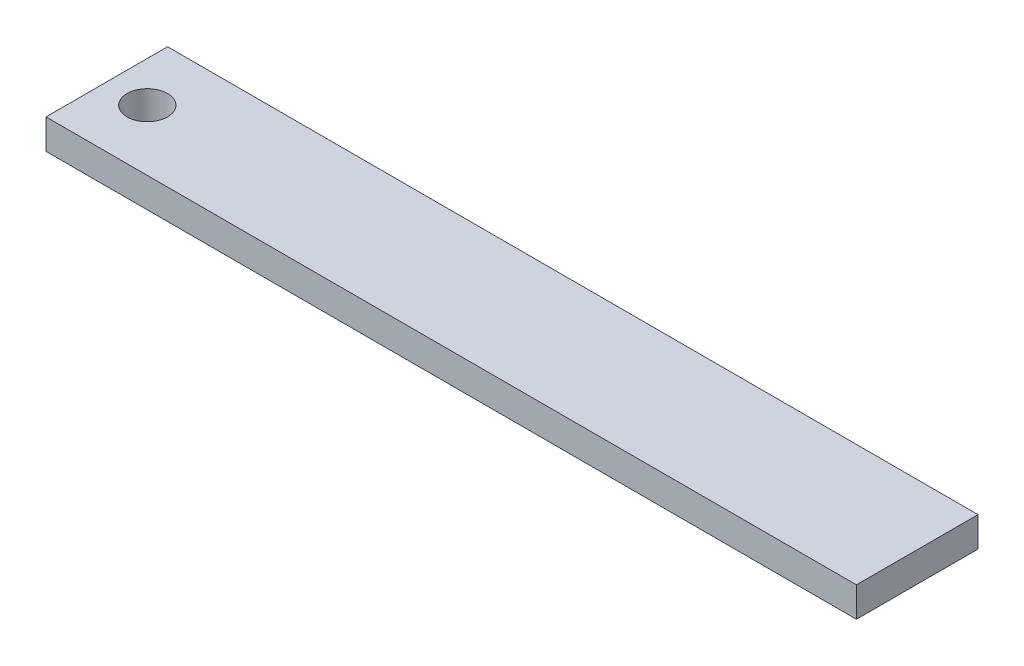
ISO-10303-21;
HEADER;
FILE_DESCRIPTION(('STEP AP214'),'2;1');
FILE_NAME('part.step','',(''),(''),'','','');
FILE_SCHEMA(('AUTOMOTIVE_DESIGN { 1 0 10303 214 1 1 1 1 }'));
ENDSEC;
DATA;
#1=APPLICATION_CONTEXT('core data for automotive mechanical design processes');
#2=APPLICATION_PROTOCOL_DEFINITION('international standard','automotive_design',2000,#1);
#3=PRODUCT_CONTEXT('',#1,'mechanical');
#4=PRODUCT('Part','Part','',(#3));
#5=PRODUCT_RELATED_PRODUCT_CATEGORY('part','',(#4));
#6=PRODUCT_DEFINITION_FORMATION('','',#4);
#7=PRODUCT_DEFINITION_CONTEXT('part definition',#1,'design');
#8=PRODUCT_DEFINITION('design','',#6,#7);
#9=PRODUCT_DEFINITION_SHAPE('','',#8);
#10=(LENGTH_UNIT() NAMED_UNIT(*) SI_UNIT(.MILLI.,.METRE.));
#11=(NAMED_UNIT(*) PLANE_ANGLE_UNIT() SI_UNIT($,.RADIAN.));
#12=(NAMED_UNIT(*) SI_UNIT($,.STERADIAN.) SOLID_ANGLE_UNIT());
#13=UNCERTAINTY_MEASURE_WITH_UNIT(LENGTH_MEASURE(1.E-05),#10,'distance_accuracy_value','');
#14=(GEOMETRIC_REPRESENTATION_CONTEXT(3) GLOBAL_UNCERTAINTY_ASSIGNED_CONTEXT((#13)) GLOBAL_UNIT_ASSIGNED_CONTEXT((#10,
#11,#12)) REPRESENTATION_CONTEXT('',''));
#15=CARTESIAN_POINT('',(0.,0.,0.));
#16=DIRECTION('',(0.,0.,1.));
#17=DIRECTION('',(1.,0.,0.));
#18=AXIS2_PLACEMENT_3D('',#15,#16,#17);
#19=CARTESIAN_POINT('',(10.,-0.7366,-1.5));
#20=DIRECTION('',(1.,0.,0.));
#21=DIRECTION('',(0.,0.,-1.));
#22=AXIS2_PLACEMENT_3D('',#19,#20,#21);
#23=PLANE('',#22);
#24=DIRECTION('',(0.,0.,-1.));
#25=VECTOR('',#24,1.);
#26=CARTESIAN_POINT('',(10.,0.,-1.5));
#27=LINE('',#26,#25);
#28=CARTESIAN_POINT('',(10.,0.,1.5));
#29=VERTEX_POINT('',#28);
#30=CARTESIAN_POINT('',(10.,0.,-1.5));
#31=VERTEX_POINT('',#30);
#32=EDGE_CURVE('E100',#29,#31,#27,.T.);
#33=ORIENTED_EDGE('',*,*,#32,.F.);
#34=DIRECTION('',(0.,1.,0.));
#35=VECTOR('',#34,1.);
#36=CARTESIAN_POINT('',(10.,-0.7366,1.5));
#37=LINE('',#36,#35);
#38=CARTESIAN_POINT('',(10.,-0.7366,1.5));
#39=VERTEX_POINT('',#38);
#40=EDGE_CURVE('E11',#39,#29,#37,.T.);
#41=ORIENTED_EDGE('',*,*,#40,.F.);
#42=DIRECTION('',(0.,0.,-1.));
#43=VECTOR('',#42,1.);
#44=CARTESIAN_POINT('',(10.,-0.7366,-1.5));
#45=LINE('',#44,#43);
#46=CARTESIAN_POINT('',(10.,-0.7366,-1.5));
#47=VERTEX_POINT('',#46);
#48=EDGE_CURVE('E93',#39,#47,#45,.T.);
#49=ORIENTED_EDGE('',*,*,#48,.T.);
#50=DIRECTION('',(0.,1.,0.));
#51=VECTOR('',#50,1.);
#52=CARTESIAN_POINT('',(10.,-0.7366,-1.5));
#53=LINE('',#52,#51);
#54=EDGE_CURVE('E38',#47,#31,#53,.T.);
#55=ORIENTED_EDGE('',*,*,#54,.T.);
#56=EDGE_LOOP('',(#33,#41,#49,#55));
#57=FACE_BOUND('',#56,.T.);
#58=ADVANCED_FACE('F35',(#57),#23,.T.);
#59=CARTESIAN_POINT('',(-10.,-0.7366,1.5));
#60=DIRECTION('',(0.,0.,1.));
#61=DIRECTION('',(1.,0.,0.));
#62=AXIS2_PLACEMENT_3D('',#59,#60,#61);
#63=PLANE('',#62);
#64=DIRECTION('',(1.,0.,0.));
#65=VECTOR('',#64,1.);
#66=CARTESIAN_POINT('',(-10.,0.,1.5));
#67=LINE('',#66,#65);
#68=CARTESIAN_POINT('',(-10.,0.,1.5));
#69=VERTEX_POINT('',#68);
#70=EDGE_CURVE('E95',#69,#29,#67,.T.);
#71=ORIENTED_EDGE('',*,*,#70,.F.);
#72=DIRECTION('',(0.,1.,0.));
#73=VECTOR('',#72,1.);
#74=CARTESIAN_POINT('',(-10.,-0.7366,1.5));
#75=LINE('',#74,#73);
#76=CARTESIAN_POINT('',(-10.,-0.7366,1.5));
#77=VERTEX_POINT('',#76);
#78=EDGE_CURVE('E44',#77,#69,#75,.T.);
#79=ORIENTED_EDGE('',*,*,#78,.F.);
#80=DIRECTION('',(1.,0.,0.));
#81=VECTOR('',#80,1.);
#82=CARTESIAN_POINT('',(-10.,-0.7366,1.5));
#83=LINE('',#82,#81);
#84=EDGE_CURVE('E90',#77,#39,#83,.T.);
#85=ORIENTED_EDGE('',*,*,#84,.T.);
#86=ORIENTED_EDGE('',*,*,#40,.T.);
#87=EDGE_LOOP('',(#71,#79,#85,#86));
#88=FACE_BOUND('',#87,.T.);
#89=ADVANCED_FACE('F111',(#88),#63,.T.);
#90=CARTESIAN_POINT('',(-10.,-0.7366,-1.5));
#91=DIRECTION('',(-1.,0.,0.));
#92=DIRECTION('',(0.,0.,1.));
#93=AXIS2_PLACEMENT_3D('',#90,#91,#92);
#94=PLANE('',#93);
#95=DIRECTION('',(0.,0.,1.));
#96=VECTOR('',#95,1.);
#97=CARTESIAN_POINT('',(-10.,0.,-1.5));
#98=LINE('',#97,#96);
#99=CARTESIAN_POINT('',(-10.,0.,-1.5));
#100=VERTEX_POINT('',#99);
#101=EDGE_CURVE('E85',#100,#69,#98,.T.);
#102=ORIENTED_EDGE('',*,*,#101,.F.);
#103=DIRECTION('',(0.,1.,0.));
#104=VECTOR('',#103,1.);
#105=CARTESIAN_POINT('',(-10.,-0.7366,-1.5));
#106=LINE('',#105,#104);
#107=CARTESIAN_POINT('',(-10.,-0.7366,-1.5));
#108=VERTEX_POINT('',#107);
#109=EDGE_CURVE('E80',#108,#100,#106,.T.);
#110=ORIENTED_EDGE('',*,*,#109,.F.);
#111=DIRECTION('',(0.,0.,1.));
#112=VECTOR('',#111,1.);
#113=CARTESIAN_POINT('',(-10.,-0.7366,-1.5));
#114=LINE('',#113,#112);
#115=EDGE_CURVE('E83',#108,#77,#114,.T.);
#116=ORIENTED_EDGE('',*,*,#115,.T.);
#117=ORIENTED_EDGE('',*,*,#78,.T.);
#118=EDGE_LOOP('',(#102,#110,#116,#117));
#119=FACE_BOUND('',#118,.T.);
#120=ADVANCED_FACE('F82',(#119),#94,.T.);
#121=CARTESIAN_POINT('',(-10.,-0.7366,-1.5));
#122=DIRECTION('',(0.,0.,-1.));
#123=DIRECTION('',(-1.,0.,0.));
#124=AXIS2_PLACEMENT_3D('',#121,#122,#123);
#125=PLANE('',#124);
#126=DIRECTION('',(-1.,0.,0.));
#127=VECTOR('',#126,1.);
#128=CARTESIAN_POINT('',(-10.,0.,-1.5));
#129=LINE('',#128,#127);
#130=EDGE_CURVE('E103',#31,#100,#129,.T.);
#131=ORIENTED_EDGE('',*,*,#130,.F.);
#132=ORIENTED_EDGE('',*,*,#54,.F.);
#133=DIRECTION('',(-1.,0.,0.));
#134=VECTOR('',#133,1.);
#135=CARTESIAN_POINT('',(-10.,-0.7366,-1.5));
#136=LINE('',#135,#134);
#137=EDGE_CURVE('E89',#47,#108,#136,.T.);
#138=ORIENTED_EDGE('',*,*,#137,.T.);
#139=ORIENTED_EDGE('',*,*,#109,.T.);
#140=EDGE_LOOP('',(#131,#132,#138,#139));
#141=FACE_BOUND('',#140,.T.);
#142=ADVANCED_FACE('F92',(#141),#125,.T.);
#143=CARTESIAN_POINT('',(0.,-0.7366,0.));
#144=DIRECTION('',(0.,1.,0.));
#145=DIRECTION('',(0.,0.,1.));
#146=AXIS2_PLACEMENT_3D('',#143,#144,#145);
#147=PLANE('',#146);
#148=CARTESIAN_POINT('',(-9.00000000000001,-0.7366,0.));
#149=DIRECTION('',(0.,1.,0.));
#150=DIRECTION('',(0.,0.,1.));
#151=AXIS2_PLACEMENT_3D('',#148,#149,#150);
#152=CIRCLE('',#151,0.500000000000001);
#153=CARTESIAN_POINT('',(-9.00000000000001,-0.7366,0.500000000000001));
#154=VERTEX_POINT('',#153);
#155=EDGE_CURVE('E104',#154,#154,#152,.T.);
#156=ORIENTED_EDGE('',*,*,#155,.T.);
#157=EDGE_LOOP('',(#156));
#158=FACE_BOUND('',#157,.T.);
#159=ORIENTED_EDGE('',*,*,#48,.F.);
#160=ORIENTED_EDGE('',*,*,#84,.F.);
#161=ORIENTED_EDGE('',*,*,#115,.F.);
#162=ORIENTED_EDGE('',*,*,#137,.F.);
#163=EDGE_LOOP('',(#159,#160,#161,#162));
#164=FACE_BOUND('',#163,.T.);
#165=ADVANCED_FACE('F88',(#158,#164),#147,.F.);
#166=CARTESIAN_POINT('',(0.,0.,0.));
#167=DIRECTION('',(0.,1.,0.));
#168=DIRECTION('',(0.,0.,1.));
#169=AXIS2_PLACEMENT_3D('',#166,#167,#168);
#170=PLANE('',#169);
#171=CARTESIAN_POINT('',(-9.00000000000001,0.,0.));
#172=DIRECTION('',(0.,1.,0.));
#173=DIRECTION('',(0.,0.,1.));
#174=AXIS2_PLACEMENT_3D('',#171,#172,#173);
#175=CIRCLE('',#174,0.500000000000001);
#176=CARTESIAN_POINT('',(-9.00000000000001,0.,0.500000000000001));
#177=VERTEX_POINT('',#176);
#178=EDGE_CURVE('E141',#177,#177,#175,.T.);
#179=ORIENTED_EDGE('',*,*,#178,.F.);
#180=EDGE_LOOP('',(#179));
#181=FACE_BOUND('',#180,.T.);
#182=ORIENTED_EDGE('',*,*,#32,.T.);
#183=ORIENTED_EDGE('',*,*,#130,.T.);
#184=ORIENTED_EDGE('',*,*,#101,.T.);
#185=ORIENTED_EDGE('',*,*,#70,.T.);
#186=EDGE_LOOP('',(#182,#183,#184,#185));
#187=FACE_BOUND('',#186,.T.);
#188=ADVANCED_FACE('F110',(#181,#187),#170,.T.);
#189=CARTESIAN_POINT('',(-9.00000000000001,-0.7366,0.));
#190=DIRECTION('',(0.,1.,0.));
#191=DIRECTION('',(0.,0.,1.));
#192=AXIS2_PLACEMENT_3D('',#189,#190,#191);
#193=CYLINDRICAL_SURFACE('',#192,0.500000000000001);
#194=ORIENTED_EDGE('',*,*,#155,.F.);
#195=EDGE_LOOP('',(#194));
#196=FACE_BOUND('',#195,.T.);
#197=ORIENTED_EDGE('',*,*,#178,.T.);
#198=EDGE_LOOP('',(#197));
#199=FACE_BOUND('',#198,.T.);
#200=ADVANCED_FACE('F129',(#196,#199),#193,.F.);
#201=CLOSED_SHELL('',(#58,#89,#120,#142,#165,#188,#200));
#202=MANIFOLD_SOLID_BREP('B2',#201);
#203=ADVANCED_BREP_SHAPE_REPRESENTATION('',(#18,#202),#14);
#204=SHAPE_DEFINITION_REPRESENTATION(#9,#203);
ENDSEC;
END-ISO-10303-21;
